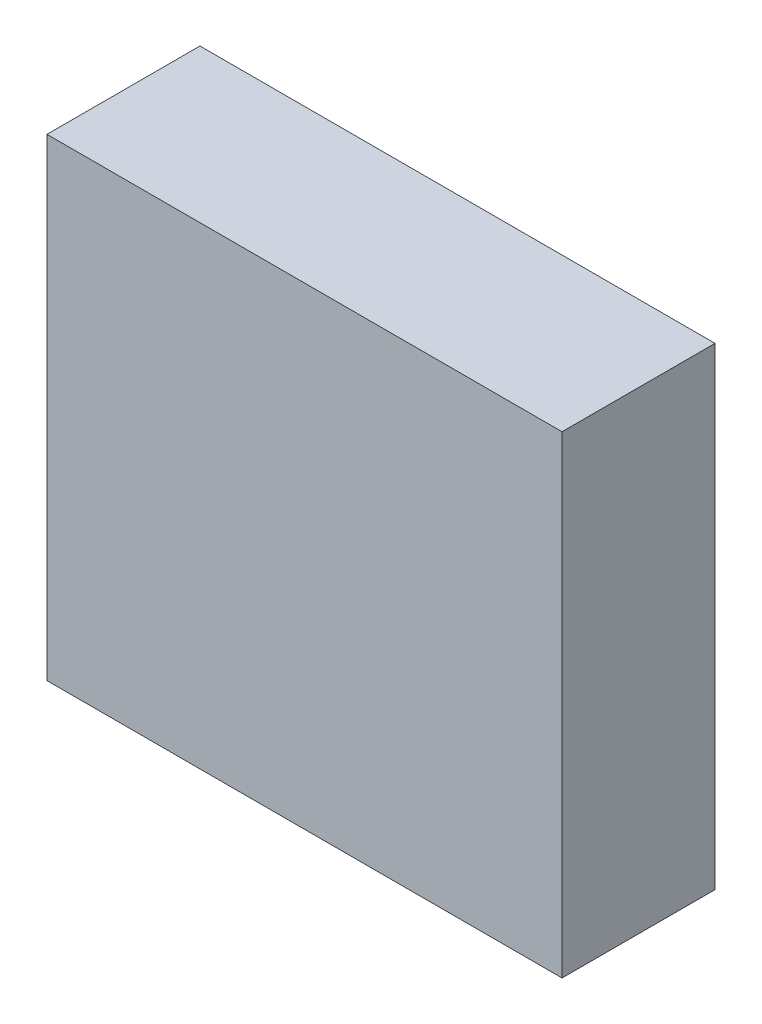
ISO-10303-21;
HEADER;
FILE_DESCRIPTION(('STEP AP214'),'2;1');
FILE_NAME('part.step','',(''),(''),'','','');
FILE_SCHEMA(('AUTOMOTIVE_DESIGN { 1 0 10303 214 1 1 1 1 }'));
ENDSEC;
DATA;
#1=APPLICATION_CONTEXT('core data for automotive mechanical design processes');
#2=APPLICATION_PROTOCOL_DEFINITION('international standard','automotive_design',2000,#1);
#3=PRODUCT_CONTEXT('',#1,'mechanical');
#4=PRODUCT('Part','Part','',(#3));
#5=PRODUCT_RELATED_PRODUCT_CATEGORY('part','',(#4));
#6=PRODUCT_DEFINITION_FORMATION('','',#4);
#7=PRODUCT_DEFINITION_CONTEXT('part definition',#1,'design');
#8=PRODUCT_DEFINITION('design','',#6,#7);
#9=PRODUCT_DEFINITION_SHAPE('','',#8);
#10=(LENGTH_UNIT() NAMED_UNIT(*) SI_UNIT(.MILLI.,.METRE.));
#11=(NAMED_UNIT(*) PLANE_ANGLE_UNIT() SI_UNIT($,.RADIAN.));
#12=(NAMED_UNIT(*) SI_UNIT($,.STERADIAN.) SOLID_ANGLE_UNIT());
#13=UNCERTAINTY_MEASURE_WITH_UNIT(LENGTH_MEASURE(1.E-05),#10,'distance_accuracy_value','');
#14=(GEOMETRIC_REPRESENTATION_CONTEXT(3) GLOBAL_UNCERTAINTY_ASSIGNED_CONTEXT((#13)) GLOBAL_UNIT_ASSIGNED_CONTEXT((#10,
#11,#12)) REPRESENTATION_CONTEXT('',''));
#15=CARTESIAN_POINT('',(0.,0.,0.));
#16=DIRECTION('',(0.,0.,1.));
#17=DIRECTION('',(1.,0.,0.));
#18=AXIS2_PLACEMENT_3D('',#15,#16,#17);
#19=CARTESIAN_POINT('',(-1.74,-0.61,0.4));
#20=DIRECTION('',(0.,0.,-1.));
#21=DIRECTION('',(0.,-1.,0.));
#22=AXIS2_PLACEMENT_3D('',#19,#20,#21);
#23=PLANE('',#22);
#24=DIRECTION('',(0.,-1.,0.));
#25=VECTOR('',#24,1.);
#26=CARTESIAN_POINT('',(-1.74,-1.85,0.4));
#27=LINE('',#26,#25);
#28=CARTESIAN_POINT('',(-1.74,-0.61,0.4));
#29=VERTEX_POINT('',#28);
#30=CARTESIAN_POINT('',(-1.74,-1.85,0.4));
#31=VERTEX_POINT('',#30);
#32=EDGE_CURVE('E85',#29,#31,#27,.T.);
#33=ORIENTED_EDGE('',*,*,#32,.T.);
#34=DIRECTION('',(1.,0.,0.));
#35=VECTOR('',#34,1.);
#36=CARTESIAN_POINT('',(-1.74,-1.85,0.4));
#37=LINE('',#36,#35);
#38=CARTESIAN_POINT('',(-0.39,-1.85,0.4));
#39=VERTEX_POINT('',#38);
#40=EDGE_CURVE('E28',#31,#39,#37,.T.);
#41=ORIENTED_EDGE('',*,*,#40,.T.);
#42=DIRECTION('',(0.,1.,0.));
#43=VECTOR('',#42,1.);
#44=CARTESIAN_POINT('',(-0.39,-1.85,0.4));
#45=LINE('',#44,#43);
#46=CARTESIAN_POINT('',(-0.39,-0.61,0.4));
#47=VERTEX_POINT('',#46);
#48=EDGE_CURVE('E56',#39,#47,#45,.T.);
#49=ORIENTED_EDGE('',*,*,#48,.T.);
#50=DIRECTION('',(-1.,0.,0.));
#51=VECTOR('',#50,1.);
#52=CARTESIAN_POINT('',(-1.74,-0.61,0.4));
#53=LINE('',#52,#51);
#54=EDGE_CURVE('E87',#47,#29,#53,.T.);
#55=ORIENTED_EDGE('',*,*,#54,.T.);
#56=EDGE_LOOP('',(#33,#41,#49,#55));
#57=FACE_BOUND('',#56,.T.);
#58=ADVANCED_FACE('F17',(#57),#23,.F.);
#59=CARTESIAN_POINT('',(-1.74,-0.61,-0.001));
#60=DIRECTION('',(0.,0.,-1.));
#61=DIRECTION('',(0.,-1.,0.));
#62=AXIS2_PLACEMENT_3D('',#59,#60,#61);
#63=PLANE('',#62);
#64=DIRECTION('',(0.,-1.,0.));
#65=VECTOR('',#64,1.);
#66=CARTESIAN_POINT('',(-1.74,-1.85,-0.001));
#67=LINE('',#66,#65);
#68=CARTESIAN_POINT('',(-1.74,-0.61,-0.001));
#69=VERTEX_POINT('',#68);
#70=CARTESIAN_POINT('',(-1.74,-1.85,-0.001));
#71=VERTEX_POINT('',#70);
#72=EDGE_CURVE('E95',#69,#71,#67,.T.);
#73=ORIENTED_EDGE('',*,*,#72,.F.);
#74=DIRECTION('',(-1.,0.,0.));
#75=VECTOR('',#74,1.);
#76=CARTESIAN_POINT('',(-1.74,-0.61,-0.001));
#77=LINE('',#76,#75);
#78=CARTESIAN_POINT('',(-0.39,-0.61,-0.001));
#79=VERTEX_POINT('',#78);
#80=EDGE_CURVE('E68',#79,#69,#77,.T.);
#81=ORIENTED_EDGE('',*,*,#80,.F.);
#82=DIRECTION('',(0.,1.,0.));
#83=VECTOR('',#82,1.);
#84=CARTESIAN_POINT('',(-0.39,-1.85,-0.001));
#85=LINE('',#84,#83);
#86=CARTESIAN_POINT('',(-0.39,-1.85,-0.001));
#87=VERTEX_POINT('',#86);
#88=EDGE_CURVE('E82',#87,#79,#85,.T.);
#89=ORIENTED_EDGE('',*,*,#88,.F.);
#90=DIRECTION('',(1.,0.,0.));
#91=VECTOR('',#90,1.);
#92=CARTESIAN_POINT('',(-1.74,-1.85,-0.001));
#93=LINE('',#92,#91);
#94=EDGE_CURVE('E11',#71,#87,#93,.T.);
#95=ORIENTED_EDGE('',*,*,#94,.F.);
#96=EDGE_LOOP('',(#73,#81,#89,#95));
#97=FACE_BOUND('',#96,.T.);
#98=ADVANCED_FACE('F19',(#97),#63,.T.);
#99=CARTESIAN_POINT('',(-1.74,-1.85,-0.001));
#100=DIRECTION('',(0.,-1.,0.));
#101=DIRECTION('',(0.,0.,-1.));
#102=AXIS2_PLACEMENT_3D('',#99,#100,#101);
#103=PLANE('',#102);
#104=DIRECTION('',(0.,0.,1.));
#105=VECTOR('',#104,1.);
#106=CARTESIAN_POINT('',(-0.39,-1.85,-0.001));
#107=LINE('',#106,#105);
#108=EDGE_CURVE('E80',#87,#39,#107,.T.);
#109=ORIENTED_EDGE('',*,*,#108,.T.);
#110=ORIENTED_EDGE('',*,*,#40,.F.);
#111=DIRECTION('',(0.,0.,1.));
#112=VECTOR('',#111,1.);
#113=CARTESIAN_POINT('',(-1.74,-1.85,-0.001));
#114=LINE('',#113,#112);
#115=EDGE_CURVE('E21',#71,#31,#114,.T.);
#116=ORIENTED_EDGE('',*,*,#115,.F.);
#117=ORIENTED_EDGE('',*,*,#94,.T.);
#118=EDGE_LOOP('',(#109,#110,#116,#117));
#119=FACE_BOUND('',#118,.T.);
#120=ADVANCED_FACE('F77',(#119),#103,.T.);
#121=CARTESIAN_POINT('',(-0.39,-1.85,-0.001));
#122=DIRECTION('',(1.,0.,0.));
#123=DIRECTION('',(0.,1.,0.));
#124=AXIS2_PLACEMENT_3D('',#121,#122,#123);
#125=PLANE('',#124);
#126=DIRECTION('',(0.,0.,1.));
#127=VECTOR('',#126,1.);
#128=CARTESIAN_POINT('',(-0.39,-0.61,-0.001));
#129=LINE('',#128,#127);
#130=EDGE_CURVE('E192',#79,#47,#129,.T.);
#131=ORIENTED_EDGE('',*,*,#130,.T.);
#132=ORIENTED_EDGE('',*,*,#48,.F.);
#133=ORIENTED_EDGE('',*,*,#108,.F.);
#134=ORIENTED_EDGE('',*,*,#88,.T.);
#135=EDGE_LOOP('',(#131,#132,#133,#134));
#136=FACE_BOUND('',#135,.T.);
#137=ADVANCED_FACE('F103',(#136),#125,.T.);
#138=CARTESIAN_POINT('',(-1.74,-0.61,-0.001));
#139=DIRECTION('',(0.,1.,0.));
#140=DIRECTION('',(1.,0.,0.));
#141=AXIS2_PLACEMENT_3D('',#138,#139,#140);
#142=PLANE('',#141);
#143=DIRECTION('',(0.,0.,1.));
#144=VECTOR('',#143,1.);
#145=CARTESIAN_POINT('',(-1.74,-0.61,-0.001));
#146=LINE('',#145,#144);
#147=EDGE_CURVE('E91',#69,#29,#146,.T.);
#148=ORIENTED_EDGE('',*,*,#147,.T.);
#149=ORIENTED_EDGE('',*,*,#54,.F.);
#150=ORIENTED_EDGE('',*,*,#130,.F.);
#151=ORIENTED_EDGE('',*,*,#80,.T.);
#152=EDGE_LOOP('',(#148,#149,#150,#151));
#153=FACE_BOUND('',#152,.T.);
#154=ADVANCED_FACE('F109',(#153),#142,.T.);
#155=CARTESIAN_POINT('',(-1.74,-1.85,-0.001));
#156=DIRECTION('',(-1.,0.,0.));
#157=DIRECTION('',(0.,0.,1.));
#158=AXIS2_PLACEMENT_3D('',#155,#156,#157);
#159=PLANE('',#158);
#160=ORIENTED_EDGE('',*,*,#115,.T.);
#161=ORIENTED_EDGE('',*,*,#32,.F.);
#162=ORIENTED_EDGE('',*,*,#147,.F.);
#163=ORIENTED_EDGE('',*,*,#72,.T.);
#164=EDGE_LOOP('',(#160,#161,#162,#163));
#165=FACE_BOUND('',#164,.T.);
#166=ADVANCED_FACE('F94',(#165),#159,.T.);
#167=CLOSED_SHELL('',(#58,#98,#120,#137,#154,#166));
#168=MANIFOLD_SOLID_BREP('B1',#167);
#169=ADVANCED_BREP_SHAPE_REPRESENTATION('',(#18,#168),#14);
#170=SHAPE_DEFINITION_REPRESENTATION(#9,#169);
ENDSEC;
END-ISO-10303-21;
